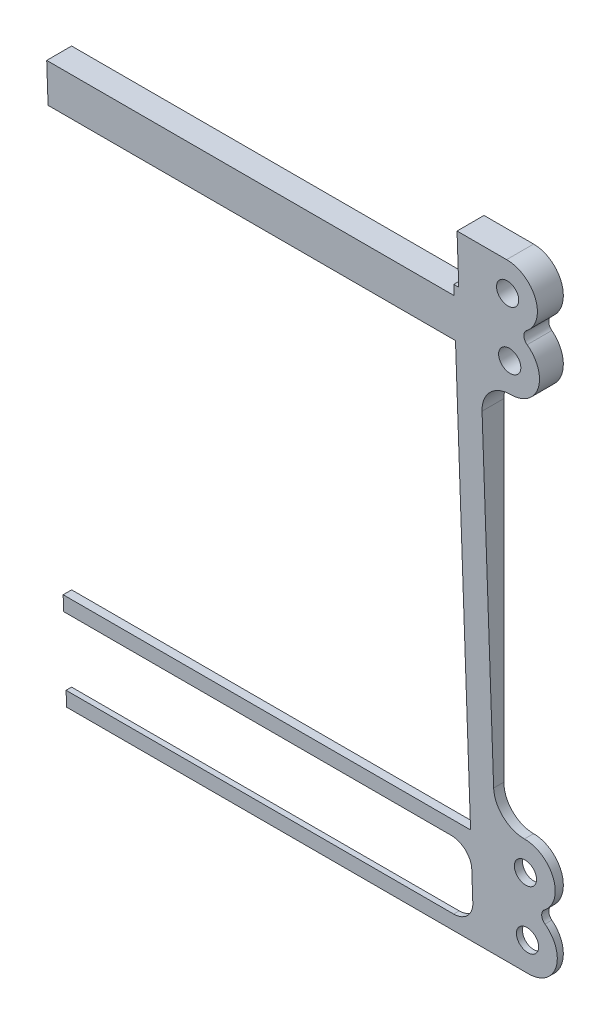
ISO-10303-21;
HEADER;
FILE_DESCRIPTION(('STEP AP214'),'2;1');
FILE_NAME('part.step','',(''),(''),'','','');
FILE_SCHEMA(('AUTOMOTIVE_DESIGN { 1 0 10303 214 1 1 1 1 }'));
ENDSEC;
DATA;
#1=APPLICATION_CONTEXT('core data for automotive mechanical design processes');
#2=APPLICATION_PROTOCOL_DEFINITION('international standard','automotive_design',2000,#1);
#3=PRODUCT_CONTEXT('',#1,'mechanical');
#4=PRODUCT('Part','Part','',(#3));
#5=PRODUCT_RELATED_PRODUCT_CATEGORY('part','',(#4));
#6=PRODUCT_DEFINITION_FORMATION('','',#4);
#7=PRODUCT_DEFINITION_CONTEXT('part definition',#1,'design');
#8=PRODUCT_DEFINITION('design','',#6,#7);
#9=PRODUCT_DEFINITION_SHAPE('','',#8);
#10=(LENGTH_UNIT() NAMED_UNIT(*) SI_UNIT(.MILLI.,.METRE.));
#11=(NAMED_UNIT(*) PLANE_ANGLE_UNIT() SI_UNIT($,.RADIAN.));
#12=(NAMED_UNIT(*) SI_UNIT($,.STERADIAN.) SOLID_ANGLE_UNIT());
#13=UNCERTAINTY_MEASURE_WITH_UNIT(LENGTH_MEASURE(1.E-05),#10,'distance_accuracy_value','');
#14=(GEOMETRIC_REPRESENTATION_CONTEXT(3) GLOBAL_UNCERTAINTY_ASSIGNED_CONTEXT((#13)) GLOBAL_UNIT_ASSIGNED_CONTEXT((#10,
#11,#12)) REPRESENTATION_CONTEXT('',''));
#15=CARTESIAN_POINT('',(0.,0.,0.));
#16=DIRECTION('',(0.,0.,1.));
#17=DIRECTION('',(1.,0.,0.));
#18=AXIS2_PLACEMENT_3D('',#15,#16,#17);
#19=CARTESIAN_POINT('',(-7.95019999999749,0.,76.2));
#20=DIRECTION('',(1.,0.,0.));
#21=DIRECTION('',(0.,0.,-1.));
#22=AXIS2_PLACEMENT_3D('',#19,#20,#21);
#23=PLANE('',#22);
#24=DIRECTION('',(0.,0.,-1.));
#25=VECTOR('',#24,1.);
#26=CARTESIAN_POINT('',(-7.95019999999749,9.52500000000006,76.2));
#27=LINE('',#26,#25);
#28=CARTESIAN_POINT('',(-7.95019999999749,9.52500000000004,2.70893443136311));
#29=VERTEX_POINT('',#28);
#30=CARTESIAN_POINT('',(-7.95019999999749,9.52500000000006,0.));
#31=VERTEX_POINT('',#30);
#32=EDGE_CURVE('E348',#29,#31,#27,.T.);
#33=ORIENTED_EDGE('',*,*,#32,.F.);
#34=DIRECTION('',(0.,0.999390827019096,0.0348994967025044));
#35=VECTOR('',#34,1.);
#36=CARTESIAN_POINT('',(-7.95019999999749,2.57484000352105,2.46622949619527));
#37=LINE('',#36,#35);
#38=CARTESIAN_POINT('',(-7.95019999999749,147.6502,7.53237270156513));
#39=VERTEX_POINT('',#38);
#40=EDGE_CURVE('E247',#29,#39,#37,.T.);
#41=ORIENTED_EDGE('',*,*,#40,.T.);
#42=DIRECTION('',(0.,0.,-1.));
#43=VECTOR('',#42,1.);
#44=CARTESIAN_POINT('',(-7.95019999999749,147.6502,76.2));
#45=LINE('',#44,#43);
#46=CARTESIAN_POINT('',(-7.95019999999749,147.6502,0.));
#47=VERTEX_POINT('',#46);
#48=EDGE_CURVE('E345',#39,#47,#45,.T.);
#49=ORIENTED_EDGE('',*,*,#48,.T.);
#50=DIRECTION('',(0.,-1.,0.));
#51=VECTOR('',#50,1.);
#52=CARTESIAN_POINT('',(-7.95019999999749,0.,0.));
#53=LINE('',#52,#51);
#54=EDGE_CURVE('E324',#47,#31,#53,.T.);
#55=ORIENTED_EDGE('',*,*,#54,.T.);
#56=EDGE_LOOP('',(#33,#41,#49,#55));
#57=FACE_BOUND('',#56,.T.);
#58=ADVANCED_FACE('F35',(#57),#23,.F.);
#59=CARTESIAN_POINT('',(0.,9.52500000000004,76.2));
#60=DIRECTION('',(0.,-1.,0.));
#61=DIRECTION('',(1.,0.,0.));
#62=AXIS2_PLACEMENT_3D('',#59,#60,#61);
#63=PLANE('',#62);
#64=DIRECTION('',(-1.,0.,0.));
#65=VECTOR('',#64,1.);
#66=CARTESIAN_POINT('',(0.,9.52500000000004,0.));
#67=LINE('',#66,#65);
#68=CARTESIAN_POINT('',(-138.423649999999,9.52500000000005,0.));
#69=VERTEX_POINT('',#68);
#70=EDGE_CURVE('E327',#31,#69,#67,.T.);
#71=ORIENTED_EDGE('',*,*,#70,.T.);
#72=DIRECTION('',(0.,0.,1.));
#73=VECTOR('',#72,1.);
#74=CARTESIAN_POINT('',(-138.423649999999,9.52500000000004,76.2));
#75=LINE('',#74,#73);
#76=CARTESIAN_POINT('',(-138.423649999999,9.52500000000006,2.7089344313631));
#77=VERTEX_POINT('',#76);
#78=EDGE_CURVE('E438',#69,#77,#75,.T.);
#79=ORIENTED_EDGE('',*,*,#78,.T.);
#80=DIRECTION('',(1.,0.,0.));
#81=VECTOR('',#80,1.);
#82=CARTESIAN_POINT('',(0.,9.52500000000004,2.70893443136311));
#83=LINE('',#82,#81);
#84=EDGE_CURVE('E245',#77,#29,#83,.T.);
#85=ORIENTED_EDGE('',*,*,#84,.T.);
#86=ORIENTED_EDGE('',*,*,#32,.T.);
#87=EDGE_LOOP('',(#71,#79,#85,#86));
#88=FACE_BOUND('',#87,.T.);
#89=ADVANCED_FACE('F448',(#88),#63,.F.);
#90=CARTESIAN_POINT('',(0.,-22.225,76.2));
#91=DIRECTION('',(0.,1.,0.));
#92=DIRECTION('',(0.,0.,1.));
#93=AXIS2_PLACEMENT_3D('',#90,#91,#92);
#94=PLANE('',#93);
#95=DIRECTION('',(-1.,0.,0.));
#96=VECTOR('',#95,1.);
#97=CARTESIAN_POINT('',(19.0500000000025,-22.225,1.6002));
#98=LINE('',#97,#96);
#99=CARTESIAN_POINT('',(9.52500000000168,-22.2249999999999,1.6002));
#100=VERTEX_POINT('',#99);
#101=CARTESIAN_POINT('',(-138.423649999999,-22.225,1.6002));
#102=VERTEX_POINT('',#101);
#103=EDGE_CURVE('E221',#100,#102,#98,.T.);
#104=ORIENTED_EDGE('',*,*,#103,.T.);
#105=DIRECTION('',(0.,0.,-1.));
#106=VECTOR('',#105,1.);
#107=CARTESIAN_POINT('',(-138.423649999999,-22.225,76.2));
#108=LINE('',#107,#106);
#109=CARTESIAN_POINT('',(-138.423649999999,-22.225,0.));
#110=VERTEX_POINT('',#109);
#111=EDGE_CURVE('E206',#102,#110,#108,.T.);
#112=ORIENTED_EDGE('',*,*,#111,.T.);
#113=DIRECTION('',(1.,0.,0.));
#114=VECTOR('',#113,1.);
#115=CARTESIAN_POINT('',(0.,-22.225,0.));
#116=LINE('',#115,#114);
#117=CARTESIAN_POINT('',(9.52500000000168,-22.2249999999999,0.));
#118=VERTEX_POINT('',#117);
#119=EDGE_CURVE('E288',#110,#118,#116,.T.);
#120=ORIENTED_EDGE('',*,*,#119,.T.);
#121=DIRECTION('',(0.,0.,-1.));
#122=VECTOR('',#121,1.);
#123=CARTESIAN_POINT('',(9.52500000000168,-22.2249999999999,76.2));
#124=LINE('',#123,#122);
#125=EDGE_CURVE('E231',#100,#118,#124,.T.);
#126=ORIENTED_EDGE('',*,*,#125,.F.);
#127=EDGE_LOOP('',(#104,#112,#120,#126));
#128=FACE_BOUND('',#127,.T.);
#129=ADVANCED_FACE('F229',(#128),#94,.F.);
#130=CARTESIAN_POINT('',(9.52500000000168,-12.6999999999999,76.2));
#131=DIRECTION('',(0.,0.,-1.));
#132=DIRECTION('',(-1.,0.,0.));
#133=AXIS2_PLACEMENT_3D('',#130,#131,#132);
#134=CYLINDRICAL_SURFACE('',#133,9.525);
#135=CARTESIAN_POINT('',(9.52500000000168,-12.6999999999999,0.));
#136=DIRECTION('',(0.,0.,1.));
#137=DIRECTION('',(1.,0.,0.));
#138=AXIS2_PLACEMENT_3D('',#135,#136,#137);
#139=CIRCLE('',#138,9.525);
#140=CARTESIAN_POINT('',(15.3712965050969,-5.18026315789494,0.));
#141=VERTEX_POINT('',#140);
#142=EDGE_CURVE('E290',#118,#141,#139,.T.);
#143=ORIENTED_EDGE('',*,*,#142,.T.);
#144=DIRECTION('',(0.,0.,-1.));
#145=VECTOR('',#144,1.);
#146=CARTESIAN_POINT('',(15.3712965050969,-5.18026315789494,76.2));
#147=LINE('',#146,#145);
#148=CARTESIAN_POINT('',(15.3712965050969,-5.18026315789493,2.19541532631071));
#149=VERTEX_POINT('',#148);
#150=EDGE_CURVE('E373',#141,#149,#147,.F.);
#151=ORIENTED_EDGE('',*,*,#150,.T.);
#152=CARTESIAN_POINT('',(9.52500000000168,-12.6999999999999,1.93282032940893));
#153=DIRECTION('',(0.,0.0348994967025044,-0.999390827019096));
#154=DIRECTION('',(0.,-0.999390827019096,-0.0348994967025044));
#155=AXIS2_PLACEMENT_3D('',#152,#153,#154);
#156=ELLIPSE('',#155,9.53080590944628,9.525);
#157=EDGE_CURVE('E286',#149,#100,#156,.T.);
#158=ORIENTED_EDGE('',*,*,#157,.T.);
#159=ORIENTED_EDGE('',*,*,#125,.T.);
#160=EDGE_LOOP('',(#143,#151,#158,#159));
#161=FACE_BOUND('',#160,.T.);
#162=ADVANCED_FACE('F522',(#161),#134,.T.);
#163=CARTESIAN_POINT('',(9.52500000000251,6.35000000000005,76.2));
#164=DIRECTION('',(0.,0.,-1.));
#165=DIRECTION('',(-1.,0.,0.));
#166=AXIS2_PLACEMENT_3D('',#163,#164,#165);
#167=CYLINDRICAL_SURFACE('',#166,9.525);
#168=CARTESIAN_POINT('',(9.52500000000251,6.35000000000005,2.59806098822679));
#169=DIRECTION('',(0.,0.0348994967025044,-0.999390827019096));
#170=DIRECTION('',(0.,-0.999390827019096,-0.0348994967025044));
#171=AXIS2_PLACEMENT_3D('',#168,#169,#170);
#172=ELLIPSE('',#171,9.53080590944628,9.525);
#173=CARTESIAN_POINT('',(9.52500000000251,15.8750000000001,2.93068131763571));
#174=VERTEX_POINT('',#173);
#175=CARTESIAN_POINT('',(15.3712965050971,-1.16973684210546,2.335465991325));
#176=VERTEX_POINT('',#175);
#177=EDGE_CURVE('E283',#174,#176,#172,.T.);
#178=ORIENTED_EDGE('',*,*,#177,.T.);
#179=DIRECTION('',(0.,0.,-1.));
#180=VECTOR('',#179,1.);
#181=CARTESIAN_POINT('',(15.3712965050971,-1.16973684210546,76.2));
#182=LINE('',#181,#180);
#183=CARTESIAN_POINT('',(15.3712965050971,-1.16973684210546,0.));
#184=VERTEX_POINT('',#183);
#185=EDGE_CURVE('E350',#176,#184,#182,.T.);
#186=ORIENTED_EDGE('',*,*,#185,.T.);
#187=CARTESIAN_POINT('',(9.52500000000251,6.35000000000005,0.));
#188=DIRECTION('',(0.,0.,1.));
#189=DIRECTION('',(1.,0.,0.));
#190=AXIS2_PLACEMENT_3D('',#187,#188,#189);
#191=CIRCLE('',#190,9.525);
#192=CARTESIAN_POINT('',(9.52500000000251,15.8750000000001,0.));
#193=VERTEX_POINT('',#192);
#194=EDGE_CURVE('E293',#184,#193,#191,.T.);
#195=ORIENTED_EDGE('',*,*,#194,.T.);
#196=DIRECTION('',(0.,0.,-1.));
#197=VECTOR('',#196,1.);
#198=CARTESIAN_POINT('',(9.52500000000251,15.8750000000001,76.2));
#199=LINE('',#198,#197);
#200=EDGE_CURVE('E367',#174,#193,#199,.T.);
#201=ORIENTED_EDGE('',*,*,#200,.F.);
#202=EDGE_LOOP('',(#178,#186,#195,#201));
#203=FACE_BOUND('',#202,.T.);
#204=ADVANCED_FACE('F518',(#203),#167,.T.);
#205=CARTESIAN_POINT('',(9.52500000000251,25.4000000000001,76.2));
#206=DIRECTION('',(0.,0.,-1.));
#207=DIRECTION('',(-1.,0.,0.));
#208=AXIS2_PLACEMENT_3D('',#205,#206,#207);
#209=CYLINDRICAL_SURFACE('',#208,9.525);
#210=CARTESIAN_POINT('',(9.52500000000251,25.4000000000001,3.26330164704465));
#211=DIRECTION('',(0.,0.0348994967025044,-0.999390827019096));
#212=DIRECTION('',(0.,-0.999390827019096,-0.0348994967025044));
#213=AXIS2_PLACEMENT_3D('',#210,#211,#212);
#214=ELLIPSE('',#213,9.53080590944628,9.525);
#215=CARTESIAN_POINT('',(0.,25.4000000000001,3.26330164704465));
#216=VERTEX_POINT('',#215);
#217=EDGE_CURVE('E281',#174,#216,#214,.T.);
#218=ORIENTED_EDGE('',*,*,#217,.F.);
#219=ORIENTED_EDGE('',*,*,#200,.T.);
#220=CARTESIAN_POINT('',(9.52500000000251,25.4000000000001,0.));
#221=DIRECTION('',(0.,0.,1.));
#222=DIRECTION('',(1.,0.,0.));
#223=AXIS2_PLACEMENT_3D('',#220,#221,#222);
#224=CIRCLE('',#223,9.525);
#225=CARTESIAN_POINT('',(0.,25.4000000000001,0.));
#226=VERTEX_POINT('',#225);
#227=EDGE_CURVE('E295',#226,#193,#224,.T.);
#228=ORIENTED_EDGE('',*,*,#227,.F.);
#229=DIRECTION('',(0.,0.,-1.));
#230=VECTOR('',#229,1.);
#231=CARTESIAN_POINT('',(0.,25.4000000000001,76.2));
#232=LINE('',#231,#230);
#233=EDGE_CURVE('E365',#216,#226,#232,.T.);
#234=ORIENTED_EDGE('',*,*,#233,.F.);
#235=EDGE_LOOP('',(#218,#219,#228,#234));
#236=FACE_BOUND('',#235,.T.);
#237=ADVANCED_FACE('F514',(#236),#209,.F.);
#238=CARTESIAN_POINT('',(0.,0.,76.2));
#239=DIRECTION('',(-1.,0.,0.));
#240=DIRECTION('',(0.,0.,1.));
#241=AXIS2_PLACEMENT_3D('',#238,#239,#240);
#242=PLANE('',#241);
#243=DIRECTION('',(0.,0.,-1.));
#244=VECTOR('',#243,1.);
#245=CARTESIAN_POINT('',(0.,131.7752,76.2));
#246=LINE('',#245,#244);
#247=CARTESIAN_POINT('',(0.,131.7752,6.97800548588361));
#248=VERTEX_POINT('',#247);
#249=CARTESIAN_POINT('',(0.,131.7752,0.));
#250=VERTEX_POINT('',#249);
#251=EDGE_CURVE('E363',#248,#250,#246,.T.);
#252=ORIENTED_EDGE('',*,*,#251,.F.);
#253=DIRECTION('',(0.,-0.999390827019096,-0.0348994967025044));
#254=VECTOR('',#253,1.);
#255=CARTESIAN_POINT('',(0.,2.57484000352105,2.46622949619527));
#256=LINE('',#255,#254);
#257=EDGE_CURVE('E278',#248,#216,#256,.T.);
#258=ORIENTED_EDGE('',*,*,#257,.T.);
#259=ORIENTED_EDGE('',*,*,#233,.T.);
#260=DIRECTION('',(0.,1.,0.));
#261=VECTOR('',#260,1.);
#262=CARTESIAN_POINT('',(0.,0.,0.));
#263=LINE('',#262,#261);
#264=EDGE_CURVE('E298',#226,#250,#263,.T.);
#265=ORIENTED_EDGE('',*,*,#264,.T.);
#266=EDGE_LOOP('',(#252,#258,#259,#265));
#267=FACE_BOUND('',#266,.T.);
#268=ADVANCED_FACE('F510',(#267),#242,.F.);
#269=CARTESIAN_POINT('',(9.52500000000251,131.7752,76.2));
#270=DIRECTION('',(0.,0.,-1.));
#271=DIRECTION('',(-1.,0.,0.));
#272=AXIS2_PLACEMENT_3D('',#269,#270,#271);
#273=CYLINDRICAL_SURFACE('',#272,9.525);
#274=CARTESIAN_POINT('',(9.52500000000251,131.7752,6.97800548588359));
#275=DIRECTION('',(0.,0.0348994967025044,-0.999390827019096));
#276=DIRECTION('',(0.,-0.999390827019096,-0.0348994967025044));
#277=AXIS2_PLACEMENT_3D('',#274,#275,#276);
#278=ELLIPSE('',#277,9.53080590944628,9.525);
#279=CARTESIAN_POINT('',(9.52500000000251,141.3002,7.31062581529253));
#280=VERTEX_POINT('',#279);
#281=EDGE_CURVE('E275',#248,#280,#278,.T.);
#282=ORIENTED_EDGE('',*,*,#281,.F.);
#283=ORIENTED_EDGE('',*,*,#251,.T.);
#284=CARTESIAN_POINT('',(9.52500000000251,131.7752,0.));
#285=DIRECTION('',(0.,0.,1.));
#286=DIRECTION('',(1.,0.,0.));
#287=AXIS2_PLACEMENT_3D('',#284,#285,#286);
#288=CIRCLE('',#287,9.525);
#289=CARTESIAN_POINT('',(9.52500000000251,141.3002,0.));
#290=VERTEX_POINT('',#289);
#291=EDGE_CURVE('E301',#290,#250,#288,.T.);
#292=ORIENTED_EDGE('',*,*,#291,.F.);
#293=DIRECTION('',(0.,0.,-1.));
#294=VECTOR('',#293,1.);
#295=CARTESIAN_POINT('',(9.52500000000251,141.3002,76.2));
#296=LINE('',#295,#294);
#297=EDGE_CURVE('E361',#280,#290,#296,.T.);
#298=ORIENTED_EDGE('',*,*,#297,.F.);
#299=EDGE_LOOP('',(#282,#283,#292,#298));
#300=FACE_BOUND('',#299,.T.);
#301=ADVANCED_FACE('F506',(#300),#273,.F.);
#302=CARTESIAN_POINT('',(9.52500000000251,150.8252,76.2));
#303=DIRECTION('',(0.,0.,-1.));
#304=DIRECTION('',(-1.,0.,0.));
#305=AXIS2_PLACEMENT_3D('',#302,#303,#304);
#306=CYLINDRICAL_SURFACE('',#305,9.52500000000001);
#307=CARTESIAN_POINT('',(9.52500000000251,150.8252,0.));
#308=DIRECTION('',(0.,0.,1.));
#309=DIRECTION('',(1.,0.,0.));
#310=AXIS2_PLACEMENT_3D('',#307,#308,#309);
#311=CIRCLE('',#310,9.52500000000001);
#312=CARTESIAN_POINT('',(15.3712965050964,158.344936842106,0.));
#313=VERTEX_POINT('',#312);
#314=EDGE_CURVE('E304',#290,#313,#311,.T.);
#315=ORIENTED_EDGE('',*,*,#314,.T.);
#316=DIRECTION('',(0.,0.,-1.));
#317=VECTOR('',#316,1.);
#318=CARTESIAN_POINT('',(15.3712965050964,158.344936842106,76.2));
#319=LINE('',#318,#317);
#320=CARTESIAN_POINT('',(15.3712965050964,158.344936842106,7.90584114160327));
#321=VERTEX_POINT('',#320);
#322=EDGE_CURVE('E378',#313,#321,#319,.F.);
#323=ORIENTED_EDGE('',*,*,#322,.T.);
#324=CARTESIAN_POINT('',(9.52500000000251,150.8252,7.64324614470145));
#325=DIRECTION('',(0.,0.0348994967025044,-0.999390827019096));
#326=DIRECTION('',(0.,-0.999390827019096,-0.0348994967025044));
#327=AXIS2_PLACEMENT_3D('',#324,#325,#326);
#328=ELLIPSE('',#327,9.53080590944628,9.52500000000001);
#329=EDGE_CURVE('E273',#321,#280,#328,.T.);
#330=ORIENTED_EDGE('',*,*,#329,.T.);
#331=ORIENTED_EDGE('',*,*,#297,.T.);
#332=EDGE_LOOP('',(#315,#323,#330,#331));
#333=FACE_BOUND('',#332,.T.);
#334=ADVANCED_FACE('F502',(#333),#306,.T.);
#335=CARTESIAN_POINT('',(9.52499999999998,169.8752,76.2));
#336=DIRECTION('',(0.,0.,-1.));
#337=DIRECTION('',(-1.,0.,0.));
#338=AXIS2_PLACEMENT_3D('',#335,#336,#337);
#339=CYLINDRICAL_SURFACE('',#338,9.52499999999999);
#340=CARTESIAN_POINT('',(9.52499999999998,169.8752,8.30848680351931));
#341=DIRECTION('',(0.,0.0348994967025044,-0.999390827019096));
#342=DIRECTION('',(0.,-0.999390827019096,-0.0348994967025044));
#343=AXIS2_PLACEMENT_3D('',#340,#341,#342);
#344=ELLIPSE('',#343,9.53080590944627,9.52499999999999);
#345=CARTESIAN_POINT('',(9.52499999999998,179.4002,8.64110713292823));
#346=VERTEX_POINT('',#345);
#347=CARTESIAN_POINT('',(15.3712965050959,162.355463157896,8.04589180661755));
#348=VERTEX_POINT('',#347);
#349=EDGE_CURVE('E270',#346,#348,#344,.T.);
#350=ORIENTED_EDGE('',*,*,#349,.T.);
#351=DIRECTION('',(0.,0.,-1.));
#352=VECTOR('',#351,1.);
#353=CARTESIAN_POINT('',(15.3712965050959,162.355463157896,76.2));
#354=LINE('',#353,#352);
#355=CARTESIAN_POINT('',(15.3712965050959,162.355463157896,0.));
#356=VERTEX_POINT('',#355);
#357=EDGE_CURVE('E375',#348,#356,#354,.T.);
#358=ORIENTED_EDGE('',*,*,#357,.T.);
#359=CARTESIAN_POINT('',(9.52499999999998,169.8752,0.));
#360=DIRECTION('',(0.,0.,1.));
#361=DIRECTION('',(1.,0.,0.));
#362=AXIS2_PLACEMENT_3D('',#359,#360,#361);
#363=CIRCLE('',#362,9.52499999999999);
#364=CARTESIAN_POINT('',(9.52499999999998,179.4002,0.));
#365=VERTEX_POINT('',#364);
#366=EDGE_CURVE('E307',#356,#365,#363,.T.);
#367=ORIENTED_EDGE('',*,*,#366,.T.);
#368=DIRECTION('',(0.,0.,-1.));
#369=VECTOR('',#368,1.);
#370=CARTESIAN_POINT('',(9.52499999999998,179.4002,76.2));
#371=LINE('',#370,#369);
#372=EDGE_CURVE('E358',#346,#365,#371,.T.);
#373=ORIENTED_EDGE('',*,*,#372,.F.);
#374=EDGE_LOOP('',(#350,#358,#367,#373));
#375=FACE_BOUND('',#374,.T.);
#376=ADVANCED_FACE('F498',(#375),#339,.T.);
#377=CARTESIAN_POINT('',(0.,179.4002,76.2));
#378=DIRECTION('',(0.,-1.,0.));
#379=DIRECTION('',(0.,0.,-1.));
#380=AXIS2_PLACEMENT_3D('',#377,#378,#379);
#381=PLANE('',#380);
#382=DIRECTION('',(0.,0.,-1.));
#383=VECTOR('',#382,1.);
#384=CARTESIAN_POINT('',(-6.35000000000002,179.4002,76.2));
#385=LINE('',#384,#383);
#386=CARTESIAN_POINT('',(-6.35000000000002,179.4002,8.64110713292823));
#387=VERTEX_POINT('',#386);
#388=CARTESIAN_POINT('',(-6.35000000000002,179.4002,0.));
#389=VERTEX_POINT('',#388);
#390=EDGE_CURVE('E356',#387,#389,#385,.T.);
#391=ORIENTED_EDGE('',*,*,#390,.F.);
#392=DIRECTION('',(-1.,0.,0.));
#393=VECTOR('',#392,1.);
#394=CARTESIAN_POINT('',(19.0500000000025,179.4002,8.64110713292823));
#395=LINE('',#394,#393);
#396=EDGE_CURVE('E233',#346,#387,#395,.T.);
#397=ORIENTED_EDGE('',*,*,#396,.F.);
#398=ORIENTED_EDGE('',*,*,#372,.T.);
#399=DIRECTION('',(-1.,0.,0.));
#400=VECTOR('',#399,1.);
#401=CARTESIAN_POINT('',(0.,179.4002,0.));
#402=LINE('',#401,#400);
#403=EDGE_CURVE('E309',#365,#389,#402,.T.);
#404=ORIENTED_EDGE('',*,*,#403,.T.);
#405=EDGE_LOOP('',(#391,#397,#398,#404));
#406=FACE_BOUND('',#405,.T.);
#407=ADVANCED_FACE('F494',(#406),#381,.F.);
#408=CARTESIAN_POINT('',(-6.35000000000002,0.,76.2));
#409=DIRECTION('',(1.,0.,0.));
#410=DIRECTION('',(0.,0.,-1.));
#411=AXIS2_PLACEMENT_3D('',#408,#409,#410);
#412=PLANE('',#411);
#413=DIRECTION('',(0.,0.,-1.));
#414=VECTOR('',#413,1.);
#415=CARTESIAN_POINT('',(-6.35000000000002,163.5252,76.2));
#416=LINE('',#415,#414);
#417=CARTESIAN_POINT('',(-6.35000000000002,163.5252,8.08673991724669));
#418=VERTEX_POINT('',#417);
#419=CARTESIAN_POINT('',(-6.35000000000002,163.5252,0.));
#420=VERTEX_POINT('',#419);
#421=EDGE_CURVE('E354',#418,#420,#416,.T.);
#422=ORIENTED_EDGE('',*,*,#421,.F.);
#423=DIRECTION('',(0.,0.999390827019096,0.0348994967025044));
#424=VECTOR('',#423,1.);
#425=CARTESIAN_POINT('',(-6.35000000000002,2.57484000352105,2.46622949619527));
#426=LINE('',#425,#424);
#427=EDGE_CURVE('E267',#418,#387,#426,.T.);
#428=ORIENTED_EDGE('',*,*,#427,.T.);
#429=ORIENTED_EDGE('',*,*,#390,.T.);
#430=DIRECTION('',(0.,-1.,0.));
#431=VECTOR('',#430,1.);
#432=CARTESIAN_POINT('',(-6.35000000000002,0.,0.));
#433=LINE('',#432,#431);
#434=EDGE_CURVE('E312',#389,#420,#433,.T.);
#435=ORIENTED_EDGE('',*,*,#434,.T.);
#436=EDGE_LOOP('',(#422,#428,#429,#435));
#437=FACE_BOUND('',#436,.T.);
#438=ADVANCED_FACE('F490',(#437),#412,.F.);
#439=CARTESIAN_POINT('',(0.,163.5252,76.2));
#440=DIRECTION('',(0.,-1.,0.));
#441=DIRECTION('',(0.,0.,-1.));
#442=AXIS2_PLACEMENT_3D('',#439,#440,#441);
#443=PLANE('',#442);
#444=DIRECTION('',(0.,0.,-1.));
#445=VECTOR('',#444,1.);
#446=CARTESIAN_POINT('',(-7.95020000000002,163.5252,76.2));
#447=LINE('',#446,#445);
#448=CARTESIAN_POINT('',(-7.95020000000002,163.5252,8.08673991724668));
#449=VERTEX_POINT('',#448);
#450=CARTESIAN_POINT('',(-7.95020000000002,163.5252,0.));
#451=VERTEX_POINT('',#450);
#452=EDGE_CURVE('E352',#449,#451,#447,.T.);
#453=ORIENTED_EDGE('',*,*,#452,.F.);
#454=DIRECTION('',(1.,0.,0.));
#455=VECTOR('',#454,1.);
#456=CARTESIAN_POINT('',(0.,163.5252,8.08673991724669));
#457=LINE('',#456,#455);
#458=EDGE_CURVE('E264',#449,#418,#457,.T.);
#459=ORIENTED_EDGE('',*,*,#458,.T.);
#460=ORIENTED_EDGE('',*,*,#421,.T.);
#461=DIRECTION('',(-1.,0.,0.));
#462=VECTOR('',#461,1.);
#463=CARTESIAN_POINT('',(0.,163.5252,0.));
#464=LINE('',#463,#462);
#465=EDGE_CURVE('E315',#420,#451,#464,.T.);
#466=ORIENTED_EDGE('',*,*,#465,.T.);
#467=EDGE_LOOP('',(#453,#459,#460,#466));
#468=FACE_BOUND('',#467,.T.);
#469=ADVANCED_FACE('F486',(#468),#443,.F.);
#470=CARTESIAN_POINT('',(-7.95020000000002,0.,76.2));
#471=DIRECTION('',(1.,0.,0.));
#472=DIRECTION('',(0.,0.,-1.));
#473=AXIS2_PLACEMENT_3D('',#470,#471,#472);
#474=PLANE('',#473);
#475=DIRECTION('',(0.,0.,-1.));
#476=VECTOR('',#475,1.);
#477=CARTESIAN_POINT('',(-7.95020000000002,160.3502,76.2));
#478=LINE('',#477,#476);
#479=CARTESIAN_POINT('',(-7.95020000000002,160.3502,7.97586647411037));
#480=VERTEX_POINT('',#479);
#481=CARTESIAN_POINT('',(-7.95020000000002,160.3502,0.));
#482=VERTEX_POINT('',#481);
#483=EDGE_CURVE('E344',#480,#482,#478,.T.);
#484=ORIENTED_EDGE('',*,*,#483,.F.);
#485=DIRECTION('',(0.,0.999390827019096,0.0348994967025044));
#486=VECTOR('',#485,1.);
#487=CARTESIAN_POINT('',(-7.95020000000002,2.57484000352105,2.46622949619527));
#488=LINE('',#487,#486);
#489=EDGE_CURVE('E261',#480,#449,#488,.T.);
#490=ORIENTED_EDGE('',*,*,#489,.T.);
#491=ORIENTED_EDGE('',*,*,#452,.T.);
#492=DIRECTION('',(0.,-1.,0.));
#493=VECTOR('',#492,1.);
#494=CARTESIAN_POINT('',(-7.95020000000002,0.,0.));
#495=LINE('',#494,#493);
#496=EDGE_CURVE('E318',#451,#482,#495,.T.);
#497=ORIENTED_EDGE('',*,*,#496,.T.);
#498=EDGE_LOOP('',(#484,#490,#491,#497));
#499=FACE_BOUND('',#498,.T.);
#500=ADVANCED_FACE('F482',(#499),#474,.F.);
#501=CARTESIAN_POINT('',(0.,160.3502,76.2));
#502=DIRECTION('',(0.,-1.,0.));
#503=DIRECTION('',(0.,0.,-1.));
#504=AXIS2_PLACEMENT_3D('',#501,#502,#503);
#505=PLANE('',#504);
#506=DIRECTION('',(-1.,0.,0.));
#507=VECTOR('',#506,1.);
#508=CARTESIAN_POINT('',(0.,160.3502,0.));
#509=LINE('',#508,#507);
#510=CARTESIAN_POINT('',(-138.423649999999,160.3502,0.));
#511=VERTEX_POINT('',#510);
#512=EDGE_CURVE('E321',#482,#511,#509,.T.);
#513=ORIENTED_EDGE('',*,*,#512,.T.);
#514=DIRECTION('',(0.,0.,1.));
#515=VECTOR('',#514,1.);
#516=CARTESIAN_POINT('',(-138.423649999999,160.3502,76.2));
#517=LINE('',#516,#515);
#518=CARTESIAN_POINT('',(-138.423649999999,160.3502,7.97586647411038));
#519=VERTEX_POINT('',#518);
#520=EDGE_CURVE('E431',#511,#519,#517,.T.);
#521=ORIENTED_EDGE('',*,*,#520,.T.);
#522=DIRECTION('',(1.,0.,0.));
#523=VECTOR('',#522,1.);
#524=CARTESIAN_POINT('',(0.,160.3502,7.97586647411037));
#525=LINE('',#524,#523);
#526=EDGE_CURVE('E259',#519,#480,#525,.T.);
#527=ORIENTED_EDGE('',*,*,#526,.T.);
#528=ORIENTED_EDGE('',*,*,#483,.T.);
#529=EDGE_LOOP('',(#513,#521,#527,#528));
#530=FACE_BOUND('',#529,.T.);
#531=ADVANCED_FACE('F478',(#530),#505,.F.);
#532=CARTESIAN_POINT('',(9.52500000000168,-12.6999999999999,76.2));
#533=DIRECTION('',(0.,0.,-1.));
#534=DIRECTION('',(-1.,0.,0.));
#535=AXIS2_PLACEMENT_3D('',#532,#533,#534);
#536=CYLINDRICAL_SURFACE('',#535,3.556);
#537=CARTESIAN_POINT('',(9.52500000000168,-12.6999999999999,1.93282032940893));
#538=DIRECTION('',(0.,0.0348994967025044,-0.999390827019096));
#539=DIRECTION('',(0.,-0.999390827019096,-0.0348994967025044));
#540=AXIS2_PLACEMENT_3D('',#537,#538,#539);
#541=ELLIPSE('',#540,3.55816753952661,3.556);
#542=CARTESIAN_POINT('',(9.52500000000168,-16.2559999999999,1.80864207309627));
#543=VERTEX_POINT('',#542);
#544=EDGE_CURVE('E256',#543,#543,#541,.T.);
#545=ORIENTED_EDGE('',*,*,#544,.F.);
#546=EDGE_LOOP('',(#545));
#547=FACE_BOUND('',#546,.T.);
#548=CARTESIAN_POINT('',(9.52500000000168,-12.6999999999999,0.));
#549=DIRECTION('',(0.,0.,1.));
#550=DIRECTION('',(1.,0.,0.));
#551=AXIS2_PLACEMENT_3D('',#548,#549,#550);
#552=CIRCLE('',#551,3.556);
#553=CARTESIAN_POINT('',(13.0810000000017,-12.6999999999999,0.));
#554=VERTEX_POINT('',#553);
#555=EDGE_CURVE('E338',#554,#554,#552,.T.);
#556=ORIENTED_EDGE('',*,*,#555,.F.);
#557=EDGE_LOOP('',(#556));
#558=FACE_BOUND('',#557,.T.);
#559=ADVANCED_FACE('F481',(#547,#558),#536,.F.);
#560=CARTESIAN_POINT('',(9.52500000000251,150.8252,76.2));
#561=DIRECTION('',(0.,0.,-1.));
#562=DIRECTION('',(-1.,0.,0.));
#563=AXIS2_PLACEMENT_3D('',#560,#561,#562);
#564=CYLINDRICAL_SURFACE('',#563,3.556);
#565=CARTESIAN_POINT('',(9.52500000000251,150.8252,7.64324614470145));
#566=DIRECTION('',(0.,0.0348994967025044,-0.999390827019096));
#567=DIRECTION('',(0.,-0.999390827019096,-0.0348994967025044));
#568=AXIS2_PLACEMENT_3D('',#565,#566,#567);
#569=ELLIPSE('',#568,3.55816753952661,3.556);
#570=CARTESIAN_POINT('',(9.52500000000251,147.2692,7.51906788838878));
#571=VERTEX_POINT('',#570);
#572=EDGE_CURVE('E253',#571,#571,#569,.T.);
#573=ORIENTED_EDGE('',*,*,#572,.F.);
#574=EDGE_LOOP('',(#573));
#575=FACE_BOUND('',#574,.T.);
#576=CARTESIAN_POINT('',(9.52500000000251,150.8252,0.));
#577=DIRECTION('',(0.,0.,1.));
#578=DIRECTION('',(1.,0.,0.));
#579=AXIS2_PLACEMENT_3D('',#576,#577,#578);
#580=CIRCLE('',#579,3.556);
#581=CARTESIAN_POINT('',(13.0810000000025,150.8252,0.));
#582=VERTEX_POINT('',#581);
#583=EDGE_CURVE('E335',#582,#582,#580,.T.);
#584=ORIENTED_EDGE('',*,*,#583,.F.);
#585=EDGE_LOOP('',(#584));
#586=FACE_BOUND('',#585,.T.);
#587=ADVANCED_FACE('F584',(#575,#586),#564,.F.);
#588=CARTESIAN_POINT('',(9.52500000000251,6.35000000000005,76.2));
#589=DIRECTION('',(0.,0.,-1.));
#590=DIRECTION('',(-1.,0.,0.));
#591=AXIS2_PLACEMENT_3D('',#588,#589,#590);
#592=CYLINDRICAL_SURFACE('',#591,3.556);
#593=CARTESIAN_POINT('',(9.52500000000251,6.35000000000005,2.59806098822679));
#594=DIRECTION('',(0.,0.0348994967025044,-0.999390827019096));
#595=DIRECTION('',(0.,-0.999390827019096,-0.0348994967025044));
#596=AXIS2_PLACEMENT_3D('',#593,#594,#595);
#597=ELLIPSE('',#596,3.55816753952661,3.556);
#598=CARTESIAN_POINT('',(9.52500000000251,2.79400000000005,2.47388273191412));
#599=VERTEX_POINT('',#598);
#600=EDGE_CURVE('E250',#599,#599,#597,.T.);
#601=ORIENTED_EDGE('',*,*,#600,.F.);
#602=EDGE_LOOP('',(#601));
#603=FACE_BOUND('',#602,.T.);
#604=CARTESIAN_POINT('',(9.52500000000251,6.35000000000005,0.));
#605=DIRECTION('',(0.,0.,1.));
#606=DIRECTION('',(1.,0.,0.));
#607=AXIS2_PLACEMENT_3D('',#604,#605,#606);
#608=CIRCLE('',#607,3.556);
#609=CARTESIAN_POINT('',(13.0810000000025,6.35000000000005,0.));
#610=VERTEX_POINT('',#609);
#611=EDGE_CURVE('E332',#610,#610,#608,.T.);
#612=ORIENTED_EDGE('',*,*,#611,.F.);
#613=EDGE_LOOP('',(#612));
#614=FACE_BOUND('',#613,.T.);
#615=ADVANCED_FACE('F577',(#603,#614),#592,.F.);
#616=CARTESIAN_POINT('',(0.,147.6502,76.2));
#617=DIRECTION('',(0.,1.,0.));
#618=DIRECTION('',(0.,0.,1.));
#619=AXIS2_PLACEMENT_3D('',#616,#617,#618);
#620=PLANE('',#619);
#621=DIRECTION('',(-1.,0.,0.));
#622=VECTOR('',#621,1.);
#623=CARTESIAN_POINT('',(0.,147.6502,7.53237270156513));
#624=LINE('',#623,#622);
#625=CARTESIAN_POINT('',(-138.423649999999,147.6502,7.53237270156513));
#626=VERTEX_POINT('',#625);
#627=EDGE_CURVE('E236',#39,#626,#624,.T.);
#628=ORIENTED_EDGE('',*,*,#627,.T.);
#629=DIRECTION('',(0.,0.,-1.));
#630=VECTOR('',#629,1.);
#631=CARTESIAN_POINT('',(-138.423649999999,147.6502,76.2));
#632=LINE('',#631,#630);
#633=CARTESIAN_POINT('',(-138.423649999999,147.6502,0.));
#634=VERTEX_POINT('',#633);
#635=EDGE_CURVE('E50',#626,#634,#632,.T.);
#636=ORIENTED_EDGE('',*,*,#635,.T.);
#637=DIRECTION('',(1.,0.,0.));
#638=VECTOR('',#637,1.);
#639=CARTESIAN_POINT('',(0.,147.6502,0.));
#640=LINE('',#639,#638);
#641=EDGE_CURVE('E330',#634,#47,#640,.T.);
#642=ORIENTED_EDGE('',*,*,#641,.T.);
#643=ORIENTED_EDGE('',*,*,#48,.F.);
#644=EDGE_LOOP('',(#628,#636,#642,#643));
#645=FACE_BOUND('',#644,.T.);
#646=ADVANCED_FACE('F574',(#645),#620,.F.);
#647=CARTESIAN_POINT('',(9.52499999999998,169.8752,76.2));
#648=DIRECTION('',(0.,0.,-1.));
#649=DIRECTION('',(-1.,0.,0.));
#650=AXIS2_PLACEMENT_3D('',#647,#648,#649);
#651=CYLINDRICAL_SURFACE('',#650,3.556);
#652=CARTESIAN_POINT('',(9.52499999999998,169.8752,8.30848680351931));
#653=DIRECTION('',(0.,0.0348994967025044,-0.999390827019096));
#654=DIRECTION('',(0.,-0.999390827019096,-0.0348994967025044));
#655=AXIS2_PLACEMENT_3D('',#652,#653,#654);
#656=ELLIPSE('',#655,3.55816753952661,3.556);
#657=CARTESIAN_POINT('',(9.52499999999998,166.3192,8.18430854720664));
#658=VERTEX_POINT('',#657);
#659=EDGE_CURVE('E232',#658,#658,#656,.T.);
#660=ORIENTED_EDGE('',*,*,#659,.F.);
#661=EDGE_LOOP('',(#660));
#662=FACE_BOUND('',#661,.T.);
#663=CARTESIAN_POINT('',(9.52499999999998,169.8752,0.));
#664=DIRECTION('',(0.,0.,1.));
#665=DIRECTION('',(1.,0.,0.));
#666=AXIS2_PLACEMENT_3D('',#663,#664,#665);
#667=CIRCLE('',#666,3.556);
#668=CARTESIAN_POINT('',(13.081,169.8752,0.));
#669=VERTEX_POINT('',#668);
#670=EDGE_CURVE('E341',#669,#669,#667,.T.);
#671=ORIENTED_EDGE('',*,*,#670,.F.);
#672=EDGE_LOOP('',(#671));
#673=FACE_BOUND('',#672,.T.);
#674=ADVANCED_FACE('F576',(#662,#673),#651,.F.);
#675=CARTESIAN_POINT('',(0.,0.,0.));
#676=DIRECTION('',(0.,0.,1.));
#677=DIRECTION('',(1.,0.,0.));
#678=AXIS2_PLACEMENT_3D('',#675,#676,#677);
#679=PLANE('',#678);
#680=ORIENTED_EDGE('',*,*,#119,.F.);
#681=DIRECTION('',(0.,1.,0.));
#682=VECTOR('',#681,1.);
#683=CARTESIAN_POINT('',(-138.423649999999,0.,0.));
#684=LINE('',#683,#682);
#685=CARTESIAN_POINT('',(-138.423649999999,-17.4498,0.));
#686=VERTEX_POINT('',#685);
#687=EDGE_CURVE('E209',#110,#686,#684,.T.);
#688=ORIENTED_EDGE('',*,*,#687,.T.);
#689=DIRECTION('',(-1.,0.,0.));
#690=VECTOR('',#689,1.);
#691=CARTESIAN_POINT('',(-268.897099999997,-17.4498,0.));
#692=LINE('',#691,#690);
#693=CARTESIAN_POINT('',(-14.3001999999975,-17.4497999999999,0.));
#694=VERTEX_POINT('',#693);
#695=EDGE_CURVE('E238',#694,#686,#692,.T.);
#696=ORIENTED_EDGE('',*,*,#695,.F.);
#697=CARTESIAN_POINT('',(-14.3001999999975,-11.0997999999999,0.));
#698=DIRECTION('',(0.,0.,1.));
#699=DIRECTION('',(1.,0.,0.));
#700=AXIS2_PLACEMENT_3D('',#697,#698,#699);
#701=CIRCLE('',#700,6.35);
#702=CARTESIAN_POINT('',(-7.9501999999975,-11.0998,0.));
#703=VERTEX_POINT('',#702);
#704=EDGE_CURVE('E410',#694,#703,#701,.T.);
#705=ORIENTED_EDGE('',*,*,#704,.T.);
#706=DIRECTION('',(0.,-1.,0.));
#707=VECTOR('',#706,1.);
#708=CARTESIAN_POINT('',(-7.95019999999749,4.74980000000006,0.));
#709=LINE('',#708,#707);
#710=CARTESIAN_POINT('',(-7.9501999999975,-1.60019999999994,0.));
#711=VERTEX_POINT('',#710);
#712=EDGE_CURVE('E426',#711,#703,#709,.T.);
#713=ORIENTED_EDGE('',*,*,#712,.F.);
#714=CARTESIAN_POINT('',(-14.3001999999975,-1.60019999999994,0.));
#715=DIRECTION('',(0.,0.,1.));
#716=DIRECTION('',(1.,0.,0.));
#717=AXIS2_PLACEMENT_3D('',#714,#715,#716);
#718=CIRCLE('',#717,6.35);
#719=CARTESIAN_POINT('',(-14.3001999999975,4.74980000000006,0.));
#720=VERTEX_POINT('',#719);
#721=EDGE_CURVE('E405',#711,#720,#718,.T.);
#722=ORIENTED_EDGE('',*,*,#721,.T.);
#723=DIRECTION('',(1.,0.,0.));
#724=VECTOR('',#723,1.);
#725=CARTESIAN_POINT('',(-7.95019999999749,4.74980000000006,0.));
#726=LINE('',#725,#724);
#727=CARTESIAN_POINT('',(-138.423649999999,4.74980000000005,0.));
#728=VERTEX_POINT('',#727);
#729=EDGE_CURVE('E430',#728,#720,#726,.T.);
#730=ORIENTED_EDGE('',*,*,#729,.F.);
#731=EDGE_CURVE('E225',#728,#69,#684,.T.);
#732=ORIENTED_EDGE('',*,*,#731,.T.);
#733=ORIENTED_EDGE('',*,*,#70,.F.);
#734=ORIENTED_EDGE('',*,*,#54,.F.);
#735=ORIENTED_EDGE('',*,*,#641,.F.);
#736=EDGE_CURVE('E213',#634,#511,#684,.T.);
#737=ORIENTED_EDGE('',*,*,#736,.T.);
#738=ORIENTED_EDGE('',*,*,#512,.F.);
#739=ORIENTED_EDGE('',*,*,#496,.F.);
#740=ORIENTED_EDGE('',*,*,#465,.F.);
#741=ORIENTED_EDGE('',*,*,#434,.F.);
#742=ORIENTED_EDGE('',*,*,#403,.F.);
#743=ORIENTED_EDGE('',*,*,#366,.F.);
#744=CARTESIAN_POINT('',(16.9303089064548,160.350200000001,0.));
#745=DIRECTION('',(0.,0.,1.));
#746=DIRECTION('',(1.,0.,0.));
#747=AXIS2_PLACEMENT_3D('',#744,#745,#746);
#748=CIRCLE('',#747,2.54);
#749=EDGE_CURVE('E384',#356,#313,#748,.T.);
#750=ORIENTED_EDGE('',*,*,#749,.T.);
#751=ORIENTED_EDGE('',*,*,#314,.F.);
#752=ORIENTED_EDGE('',*,*,#291,.T.);
#753=ORIENTED_EDGE('',*,*,#264,.F.);
#754=ORIENTED_EDGE('',*,*,#227,.T.);
#755=ORIENTED_EDGE('',*,*,#194,.F.);
#756=CARTESIAN_POINT('',(16.9303089064556,-3.17500000000027,0.));
#757=DIRECTION('',(0.,0.,1.));
#758=DIRECTION('',(1.,0.,0.));
#759=AXIS2_PLACEMENT_3D('',#756,#757,#758);
#760=CIRCLE('',#759,2.54);
#761=EDGE_CURVE('E380',#184,#141,#760,.T.);
#762=ORIENTED_EDGE('',*,*,#761,.T.);
#763=ORIENTED_EDGE('',*,*,#142,.F.);
#764=EDGE_LOOP('',(#680,#688,#696,#705,#713,#722,#730,#732,#733,#734,#735,#737,#738,#739,#740,
#741,#742,#743,#750,#751,#752,#753,#754,#755,#762,#763));
#765=FACE_BOUND('',#764,.T.);
#766=ORIENTED_EDGE('',*,*,#611,.T.);
#767=EDGE_LOOP('',(#766));
#768=FACE_BOUND('',#767,.T.);
#769=ORIENTED_EDGE('',*,*,#583,.T.);
#770=EDGE_LOOP('',(#769));
#771=FACE_BOUND('',#770,.T.);
#772=ORIENTED_EDGE('',*,*,#555,.T.);
#773=EDGE_LOOP('',(#772));
#774=FACE_BOUND('',#773,.T.);
#775=ORIENTED_EDGE('',*,*,#670,.T.);
#776=EDGE_LOOP('',(#775));
#777=FACE_BOUND('',#776,.T.);
#778=ADVANCED_FACE('F424',(#765,#768,#771,#774,#777),#679,.F.);
#779=CARTESIAN_POINT('',(19.0500000000025,-22.225,1.6002));
#780=DIRECTION('',(0.,0.0348994967025044,-0.999390827019096));
#781=DIRECTION('',(0.,0.999390827019096,0.0348994967025044));
#782=AXIS2_PLACEMENT_3D('',#779,#780,#781);
#783=PLANE('',#782);
#784=ORIENTED_EDGE('',*,*,#544,.T.);
#785=EDGE_LOOP('',(#784));
#786=FACE_BOUND('',#785,.T.);
#787=ORIENTED_EDGE('',*,*,#572,.T.);
#788=EDGE_LOOP('',(#787));
#789=FACE_BOUND('',#788,.T.);
#790=ORIENTED_EDGE('',*,*,#600,.T.);
#791=EDGE_LOOP('',(#790));
#792=FACE_BOUND('',#791,.T.);
#793=ORIENTED_EDGE('',*,*,#659,.T.);
#794=EDGE_LOOP('',(#793));
#795=FACE_BOUND('',#794,.T.);
#796=ORIENTED_EDGE('',*,*,#526,.F.);
#797=DIRECTION('',(0.,0.999390827019096,0.0348994967025044));
#798=VECTOR('',#797,1.);
#799=CARTESIAN_POINT('',(-138.423649999999,-42.9005162307363,0.878195063583495));
#800=LINE('',#799,#798);
#801=EDGE_CURVE('E228',#626,#519,#800,.T.);
#802=ORIENTED_EDGE('',*,*,#801,.F.);
#803=ORIENTED_EDGE('',*,*,#627,.F.);
#804=ORIENTED_EDGE('',*,*,#40,.F.);
#805=ORIENTED_EDGE('',*,*,#84,.F.);
#806=CARTESIAN_POINT('',(-138.423649999999,4.74980000000006,2.54218077288609));
#807=VERTEX_POINT('',#806);
#808=EDGE_CURVE('E226',#807,#77,#800,.T.);
#809=ORIENTED_EDGE('',*,*,#808,.F.);
#810=DIRECTION('',(1.,0.,0.));
#811=VECTOR('',#810,1.);
#812=CARTESIAN_POINT('',(19.0500000000025,4.74980000000006,2.54218077288609));
#813=LINE('',#812,#811);
#814=CARTESIAN_POINT('',(-14.3001999999975,4.74980000000006,2.54218077288609));
#815=VERTEX_POINT('',#814);
#816=EDGE_CURVE('E388',#807,#815,#813,.T.);
#817=ORIENTED_EDGE('',*,*,#816,.T.);
#818=CARTESIAN_POINT('',(-14.3001999999975,-1.60019999999994,2.32043388661347));
#819=DIRECTION('',(0.,0.0348994967025044,-0.999390827019096));
#820=DIRECTION('',(0.,0.999390827019096,0.0348994967025044));
#821=AXIS2_PLACEMENT_3D('',#818,#819,#820);
#822=ELLIPSE('',#821,6.35387060629752,6.35);
#823=CARTESIAN_POINT('',(-7.9501999999975,-1.60019999999994,2.32043388661347));
#824=VERTEX_POINT('',#823);
#825=EDGE_CURVE('E408',#815,#824,#822,.T.);
#826=ORIENTED_EDGE('',*,*,#825,.T.);
#827=DIRECTION('',(0.,-0.999390827019096,-0.0348994967025044));
#828=VECTOR('',#827,1.);
#829=CARTESIAN_POINT('',(-7.95019999999751,-22.2249999999999,1.6002));
#830=LINE('',#829,#828);
#831=CARTESIAN_POINT('',(-7.9501999999975,-11.0998,1.98870054474963));
#832=VERTEX_POINT('',#831);
#833=EDGE_CURVE('E390',#824,#832,#830,.T.);
#834=ORIENTED_EDGE('',*,*,#833,.T.);
#835=CARTESIAN_POINT('',(-14.3001999999975,-11.0997999999999,1.98870054474963));
#836=DIRECTION('',(0.,0.0348994967025044,-0.999390827019096));
#837=DIRECTION('',(0.,0.999390827019096,0.0348994967025044));
#838=AXIS2_PLACEMENT_3D('',#835,#836,#837);
#839=ELLIPSE('',#838,6.35387060629752,6.35);
#840=CARTESIAN_POINT('',(-14.3001999999975,-17.4498,1.76695365847701));
#841=VERTEX_POINT('',#840);
#842=EDGE_CURVE('E43',#832,#841,#839,.T.);
#843=ORIENTED_EDGE('',*,*,#842,.T.);
#844=DIRECTION('',(-1.,0.,0.));
#845=VECTOR('',#844,1.);
#846=CARTESIAN_POINT('',(19.0500000000025,-17.4497999999999,1.76695365847701));
#847=LINE('',#846,#845);
#848=CARTESIAN_POINT('',(-138.423649999999,-17.4498,1.76695365847701));
#849=VERTEX_POINT('',#848);
#850=EDGE_CURVE('E224',#841,#849,#847,.T.);
#851=ORIENTED_EDGE('',*,*,#850,.T.);
#852=EDGE_CURVE('E58',#102,#849,#800,.T.);
#853=ORIENTED_EDGE('',*,*,#852,.F.);
#854=ORIENTED_EDGE('',*,*,#103,.F.);
#855=ORIENTED_EDGE('',*,*,#157,.F.);
#856=CARTESIAN_POINT('',(16.9303089064556,-3.17500000000027,2.26544065881785));
#857=DIRECTION('',(0.,0.0348994967025044,-0.999390827019096));
#858=DIRECTION('',(0.,0.999390827019096,0.0348994967025044));
#859=AXIS2_PLACEMENT_3D('',#856,#857,#858);
#860=ELLIPSE('',#859,2.54154824251901,2.54);
#861=EDGE_CURVE('E382',#149,#176,#860,.T.);
#862=ORIENTED_EDGE('',*,*,#861,.T.);
#863=ORIENTED_EDGE('',*,*,#177,.F.);
#864=ORIENTED_EDGE('',*,*,#217,.T.);
#865=ORIENTED_EDGE('',*,*,#257,.F.);
#866=ORIENTED_EDGE('',*,*,#281,.T.);
#867=ORIENTED_EDGE('',*,*,#329,.F.);
#868=CARTESIAN_POINT('',(16.9303089064548,160.350200000001,7.9758664741104));
#869=DIRECTION('',(0.,0.0348994967025044,-0.999390827019096));
#870=DIRECTION('',(0.,0.999390827019096,0.0348994967025044));
#871=AXIS2_PLACEMENT_3D('',#868,#869,#870);
#872=ELLIPSE('',#871,2.54154824251901,2.54);
#873=EDGE_CURVE('E386',#321,#348,#872,.T.);
#874=ORIENTED_EDGE('',*,*,#873,.T.);
#875=ORIENTED_EDGE('',*,*,#349,.F.);
#876=ORIENTED_EDGE('',*,*,#396,.T.);
#877=ORIENTED_EDGE('',*,*,#427,.F.);
#878=ORIENTED_EDGE('',*,*,#458,.F.);
#879=ORIENTED_EDGE('',*,*,#489,.F.);
#880=EDGE_LOOP('',(#796,#802,#803,#804,#805,#809,#817,#826,#834,#843,#851,#853,#854,#855,#862,
#863,#864,#865,#866,#867,#874,#875,#876,#877,#878,#879));
#881=FACE_BOUND('',#880,.T.);
#882=ADVANCED_FACE('F219',(#786,#789,#792,#795,#881),#783,.F.);
#883=CARTESIAN_POINT('',(16.9303089064556,-3.17500000000027,76.2));
#884=DIRECTION('',(0.,0.,1.));
#885=DIRECTION('',(1.,0.,0.));
#886=AXIS2_PLACEMENT_3D('',#883,#884,#885);
#887=CYLINDRICAL_SURFACE('',#886,2.54);
#888=ORIENTED_EDGE('',*,*,#861,.F.);
#889=ORIENTED_EDGE('',*,*,#150,.F.);
#890=ORIENTED_EDGE('',*,*,#761,.F.);
#891=ORIENTED_EDGE('',*,*,#185,.F.);
#892=EDGE_LOOP('',(#888,#889,#890,#891));
#893=FACE_BOUND('',#892,.T.);
#894=ADVANCED_FACE('F529',(#893),#887,.F.);
#895=CARTESIAN_POINT('',(16.9303089064548,160.350200000001,76.2));
#896=DIRECTION('',(0.,0.,1.));
#897=DIRECTION('',(1.,0.,0.));
#898=AXIS2_PLACEMENT_3D('',#895,#896,#897);
#899=CYLINDRICAL_SURFACE('',#898,2.54);
#900=ORIENTED_EDGE('',*,*,#873,.F.);
#901=ORIENTED_EDGE('',*,*,#322,.F.);
#902=ORIENTED_EDGE('',*,*,#749,.F.);
#903=ORIENTED_EDGE('',*,*,#357,.F.);
#904=EDGE_LOOP('',(#900,#901,#902,#903));
#905=FACE_BOUND('',#904,.T.);
#906=ADVANCED_FACE('F531',(#905),#899,.F.);
#907=CARTESIAN_POINT('',(-268.897099999997,-17.4498,8.64110713292829));
#908=DIRECTION('',(0.,-1.,0.));
#909=DIRECTION('',(1.,0.,0.));
#910=AXIS2_PLACEMENT_3D('',#907,#908,#909);
#911=PLANE('',#910);
#912=ORIENTED_EDGE('',*,*,#695,.T.);
#913=DIRECTION('',(0.,0.,1.));
#914=VECTOR('',#913,1.);
#915=CARTESIAN_POINT('',(-138.423649999999,-17.4498,8.64110713292829));
#916=LINE('',#915,#914);
#917=EDGE_CURVE('E420',#686,#849,#916,.T.);
#918=ORIENTED_EDGE('',*,*,#917,.T.);
#919=ORIENTED_EDGE('',*,*,#850,.F.);
#920=DIRECTION('',(0.,0.,-1.));
#921=VECTOR('',#920,1.);
#922=CARTESIAN_POINT('',(-14.3001999999975,-17.4497999999999,0.));
#923=LINE('',#922,#921);
#924=EDGE_CURVE('E397',#841,#694,#923,.T.);
#925=ORIENTED_EDGE('',*,*,#924,.T.);
#926=EDGE_LOOP('',(#912,#918,#919,#925));
#927=FACE_BOUND('',#926,.T.);
#928=ADVANCED_FACE('F418',(#927),#911,.F.);
#929=CARTESIAN_POINT('',(-7.95019999999749,4.74980000000006,8.64110713292829));
#930=DIRECTION('',(1.,0.,0.));
#931=DIRECTION('',(0.,1.,0.));
#932=AXIS2_PLACEMENT_3D('',#929,#930,#931);
#933=PLANE('',#932);
#934=ORIENTED_EDGE('',*,*,#833,.F.);
#935=DIRECTION('',(0.,0.,-1.));
#936=VECTOR('',#935,1.);
#937=CARTESIAN_POINT('',(-7.9501999999975,-1.60019999999994,0.));
#938=LINE('',#937,#936);
#939=EDGE_CURVE('E402',#824,#711,#938,.T.);
#940=ORIENTED_EDGE('',*,*,#939,.T.);
#941=ORIENTED_EDGE('',*,*,#712,.T.);
#942=DIRECTION('',(0.,0.,-1.));
#943=VECTOR('',#942,1.);
#944=CARTESIAN_POINT('',(-7.9501999999975,-11.0998,1.76695365847701));
#945=LINE('',#944,#943);
#946=EDGE_CURVE('E400',#703,#832,#945,.F.);
#947=ORIENTED_EDGE('',*,*,#946,.T.);
#948=EDGE_LOOP('',(#934,#940,#941,#947));
#949=FACE_BOUND('',#948,.T.);
#950=ADVANCED_FACE('F428',(#949),#933,.F.);
#951=CARTESIAN_POINT('',(-7.95019999999749,4.74980000000006,8.64110713292829));
#952=DIRECTION('',(0.,1.,0.));
#953=DIRECTION('',(-1.,0.,0.));
#954=AXIS2_PLACEMENT_3D('',#951,#952,#953);
#955=PLANE('',#954);
#956=ORIENTED_EDGE('',*,*,#816,.F.);
#957=DIRECTION('',(0.,0.,-1.));
#958=VECTOR('',#957,1.);
#959=CARTESIAN_POINT('',(-138.423649999999,4.74980000000005,8.64110713292829));
#960=LINE('',#959,#958);
#961=EDGE_CURVE('E11',#807,#728,#960,.T.);
#962=ORIENTED_EDGE('',*,*,#961,.T.);
#963=ORIENTED_EDGE('',*,*,#729,.T.);
#964=DIRECTION('',(0.,0.,-1.));
#965=VECTOR('',#964,1.);
#966=CARTESIAN_POINT('',(-14.3001999999975,4.74980000000006,2.54218077288609));
#967=LINE('',#966,#965);
#968=EDGE_CURVE('E394',#720,#815,#967,.F.);
#969=ORIENTED_EDGE('',*,*,#968,.T.);
#970=EDGE_LOOP('',(#956,#962,#963,#969));
#971=FACE_BOUND('',#970,.T.);
#972=ADVANCED_FACE('F458',(#971),#955,.F.);
#973=CARTESIAN_POINT('',(-14.3001999999975,-1.60019999999994,8.64110713292829));
#974=DIRECTION('',(0.,0.,1.));
#975=DIRECTION('',(1.,0.,0.));
#976=AXIS2_PLACEMENT_3D('',#973,#974,#975);
#977=CYLINDRICAL_SURFACE('',#976,6.35);
#978=ORIENTED_EDGE('',*,*,#825,.F.);
#979=ORIENTED_EDGE('',*,*,#968,.F.);
#980=ORIENTED_EDGE('',*,*,#721,.F.);
#981=ORIENTED_EDGE('',*,*,#939,.F.);
#982=EDGE_LOOP('',(#978,#979,#980,#981));
#983=FACE_BOUND('',#982,.T.);
#984=ADVANCED_FACE('F462',(#983),#977,.F.);
#985=CARTESIAN_POINT('',(-14.3001999999975,-11.0997999999999,8.64110713292829));
#986=DIRECTION('',(0.,0.,1.));
#987=DIRECTION('',(1.,0.,0.));
#988=AXIS2_PLACEMENT_3D('',#985,#986,#987);
#989=CYLINDRICAL_SURFACE('',#988,6.35);
#990=ORIENTED_EDGE('',*,*,#842,.F.);
#991=ORIENTED_EDGE('',*,*,#946,.F.);
#992=ORIENTED_EDGE('',*,*,#704,.F.);
#993=ORIENTED_EDGE('',*,*,#924,.F.);
#994=EDGE_LOOP('',(#990,#991,#992,#993));
#995=FACE_BOUND('',#994,.T.);
#996=ADVANCED_FACE('F37',(#995),#989,.F.);
#997=CARTESIAN_POINT('',(-138.423649999999,-42.5991296493172,-7.7523874180071));
#998=DIRECTION('',(1.,0.,0.));
#999=DIRECTION('',(0.,0.,-1.));
#1000=AXIS2_PLACEMENT_3D('',#997,#998,#999);
#1001=PLANE('',#1000);
#1002=ORIENTED_EDGE('',*,*,#731,.F.);
#1003=ORIENTED_EDGE('',*,*,#961,.F.);
#1004=ORIENTED_EDGE('',*,*,#808,.T.);
#1005=ORIENTED_EDGE('',*,*,#78,.F.);
#1006=EDGE_LOOP('',(#1002,#1003,#1004,#1005));
#1007=FACE_BOUND('',#1006,.T.);
#1008=ADVANCED_FACE('F444',(#1007),#1001,.F.);
#1009=ORIENTED_EDGE('',*,*,#852,.T.);
#1010=ORIENTED_EDGE('',*,*,#917,.F.);
#1011=ORIENTED_EDGE('',*,*,#687,.F.);
#1012=ORIENTED_EDGE('',*,*,#111,.F.);
#1013=EDGE_LOOP('',(#1009,#1010,#1011,#1012));
#1014=FACE_BOUND('',#1013,.T.);
#1015=ADVANCED_FACE('F207',(#1014),#1001,.F.);
#1016=ORIENTED_EDGE('',*,*,#736,.F.);
#1017=ORIENTED_EDGE('',*,*,#635,.F.);
#1018=ORIENTED_EDGE('',*,*,#801,.T.);
#1019=ORIENTED_EDGE('',*,*,#520,.F.);
#1020=EDGE_LOOP('',(#1016,#1017,#1018,#1019));
#1021=FACE_BOUND('',#1020,.T.);
#1022=ADVANCED_FACE('F557',(#1021),#1001,.F.);
#1023=CLOSED_SHELL('',(#58,#89,#129,#162,#204,#237,#268,#301,#334,#376,#407,#438,#469,#500,#531,
#559,#587,#615,#646,#674,#778,#882,#894,#906,#928,#950,#972,#984,#996,#1008,#1015,#1022));
#1024=MANIFOLD_SOLID_BREP('B2',#1023);
#1025=ADVANCED_BREP_SHAPE_REPRESENTATION('',(#18,#1024),#14);
#1026=SHAPE_DEFINITION_REPRESENTATION(#9,#1025);
ENDSEC;
END-ISO-10303-21;
